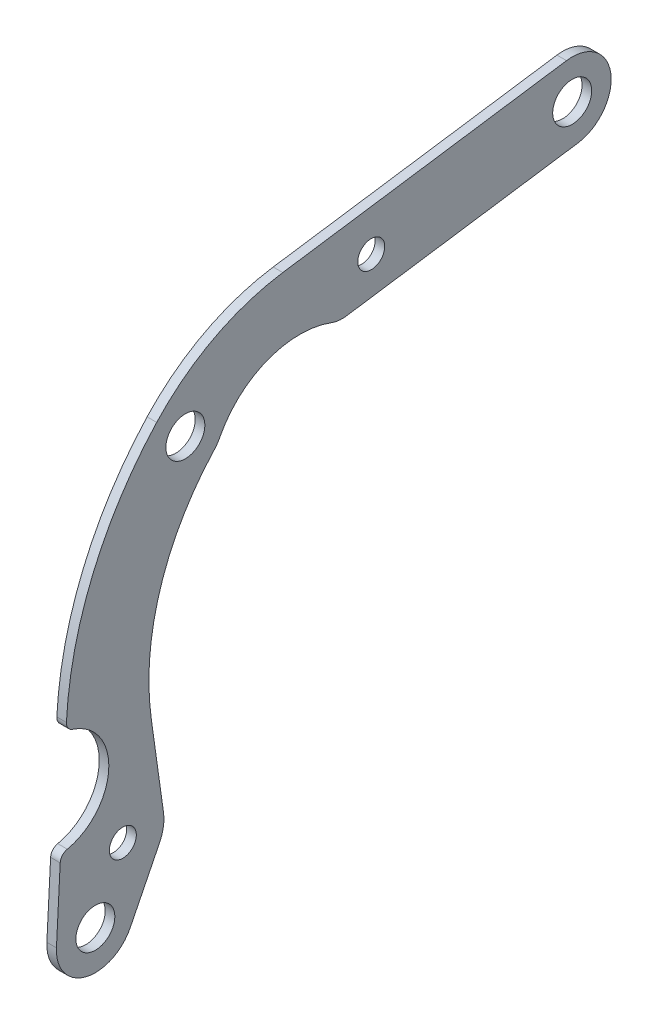
ISO-10303-21;
HEADER;
FILE_DESCRIPTION(('STEP AP214'),'2;1');
FILE_NAME('part.step','',(''),(''),'','','');
FILE_SCHEMA(('AUTOMOTIVE_DESIGN { 1 0 10303 214 1 1 1 1 }'));
ENDSEC;
DATA;
#1=APPLICATION_CONTEXT('core data for automotive mechanical design processes');
#2=APPLICATION_PROTOCOL_DEFINITION('international standard','automotive_design',2000,#1);
#3=PRODUCT_CONTEXT('',#1,'mechanical');
#4=PRODUCT('Part','Part','',(#3));
#5=PRODUCT_RELATED_PRODUCT_CATEGORY('part','',(#4));
#6=PRODUCT_DEFINITION_FORMATION('','',#4);
#7=PRODUCT_DEFINITION_CONTEXT('part definition',#1,'design');
#8=PRODUCT_DEFINITION('design','',#6,#7);
#9=PRODUCT_DEFINITION_SHAPE('','',#8);
#10=(LENGTH_UNIT() NAMED_UNIT(*) SI_UNIT(.MILLI.,.METRE.));
#11=(NAMED_UNIT(*) PLANE_ANGLE_UNIT() SI_UNIT($,.RADIAN.));
#12=(NAMED_UNIT(*) SI_UNIT($,.STERADIAN.) SOLID_ANGLE_UNIT());
#13=UNCERTAINTY_MEASURE_WITH_UNIT(LENGTH_MEASURE(1.E-05),#10,'distance_accuracy_value','');
#14=(GEOMETRIC_REPRESENTATION_CONTEXT(3) GLOBAL_UNCERTAINTY_ASSIGNED_CONTEXT((#13)) GLOBAL_UNIT_ASSIGNED_CONTEXT((#10,
#11,#12)) REPRESENTATION_CONTEXT('',''));
#15=CARTESIAN_POINT('',(0.,0.,0.));
#16=DIRECTION('',(0.,0.,1.));
#17=DIRECTION('',(1.,0.,0.));
#18=AXIS2_PLACEMENT_3D('',#15,#16,#17);
#19=CARTESIAN_POINT('',(3.2,159.099025766711,-159.099025767245));
#20=DIRECTION('',(1.,0.,0.));
#21=DIRECTION('',(0.,0.,-1.));
#22=AXIS2_PLACEMENT_3D('',#19,#20,#21);
#23=PLANE('',#22);
#24=CARTESIAN_POINT('',(3.2,19.9975389871156,-9.17051985760859));
#25=DIRECTION('',(1.,0.,0.));
#26=DIRECTION('',(0.,0.,-1.));
#27=AXIS2_PLACEMENT_3D('',#24,#25,#26);
#28=CIRCLE('',#27,4.5);
#29=CARTESIAN_POINT('',(3.2,19.9975389871156,-13.6705198576086));
#30=VERTEX_POINT('',#29);
#31=EDGE_CURVE('E397',#30,#30,#28,.T.);
#32=ORIENTED_EDGE('',*,*,#31,.F.);
#33=EDGE_LOOP('',(#32));
#34=FACE_BOUND('',#33,.T.);
#35=CARTESIAN_POINT('',(3.2,159.099025766711,-159.099025767245));
#36=DIRECTION('',(1.,0.,0.));
#37=DIRECTION('',(0.,0.,-1.));
#38=AXIS2_PLACEMENT_3D('',#35,#36,#37);
#39=CIRCLE('',#38,6.50000000000002);
#40=CARTESIAN_POINT('',(3.2,159.099025766711,-165.599025767245));
#41=VERTEX_POINT('',#40);
#42=EDGE_CURVE('E409',#41,#41,#39,.T.);
#43=ORIENTED_EDGE('',*,*,#42,.F.);
#44=EDGE_LOOP('',(#43));
#45=FACE_BOUND('',#44,.T.);
#46=CARTESIAN_POINT('',(3.2,159.099025766711,-159.099025767245));
#47=DIRECTION('',(1.,0.,0.));
#48=DIRECTION('',(0.,0.,-1.));
#49=AXIS2_PLACEMENT_3D('',#46,#47,#48);
#50=CIRCLE('',#49,12.9999999937128);
#51=CARTESIAN_POINT('',(3.2,146.237090088761,-160.988631666051));
#52=VERTEX_POINT('',#51);
#53=CARTESIAN_POINT('',(3.2,171.960961444661,-157.209419868439));
#54=VERTEX_POINT('',#53);
#55=EDGE_CURVE('E203',#52,#54,#50,.T.);
#56=ORIENTED_EDGE('',*,*,#55,.T.);
#57=DIRECTION('',(0.,-0.145354299978452,0.989379668013131));
#58=VECTOR('',#57,1.);
#59=CARTESIAN_POINT('',(3.2,158.051475499341,-62.5320516113296));
#60=LINE('',#59,#58);
#61=CARTESIAN_POINT('',(3.2,158.051475499341,-62.5320516113296));
#62=VERTEX_POINT('',#61);
#63=EDGE_CURVE('E162',#54,#62,#60,.T.);
#64=ORIENTED_EDGE('',*,*,#63,.T.);
#65=CARTESIAN_POINT('',(3.2,87.590518168881,-72.8837936772932));
#66=DIRECTION('',(1.,0.,0.));
#67=DIRECTION('',(0.,0.,-1.));
#68=AXIS2_PLACEMENT_3D('',#65,#66,#67);
#69=CIRCLE('',#68,71.2173087930536);
#70=CARTESIAN_POINT('',(3.2,135.797177398432,-20.4622038726038));
#71=VERTEX_POINT('',#70);
#72=EDGE_CURVE('E206',#62,#71,#69,.T.);
#73=ORIENTED_EDGE('',*,*,#72,.T.);
#74=CARTESIAN_POINT('',(3.2,58.1483291640224,-104.900249072292));
#75=DIRECTION('',(1.,0.,0.));
#76=DIRECTION('',(0.,0.,1.));
#77=AXIS2_PLACEMENT_3D('',#74,#75,#76);
#78=CIRCLE('',#77,114.713238596402);
#79=CARTESIAN_POINT('',(3.2,64.15195619969,9.65577901742271));
#80=VERTEX_POINT('',#79);
#81=EDGE_CURVE('E208',#71,#80,#78,.T.);
#82=ORIENTED_EDGE('',*,*,#81,.T.);
#83=CARTESIAN_POINT('',(3.2,63.9949483309612,6.65989041315899));
#84=DIRECTION('',(1.,0.,0.));
#85=DIRECTION('',(0.,0.,1.));
#86=AXIS2_PLACEMENT_3D('',#83,#84,#85);
#87=CIRCLE('',#86,3.);
#88=CARTESIAN_POINT('',(3.2,61.1420290630156,7.58771132830644));
#89=VERTEX_POINT('',#88);
#90=EDGE_CURVE('E210',#80,#89,#87,.T.);
#91=ORIENTED_EDGE('',*,*,#90,.T.);
#92=CARTESIAN_POINT('',(3.2,44.5,13.));
#93=DIRECTION('',(-1.,0.,0.));
#94=DIRECTION('',(0.,0.,-1.));
#95=AXIS2_PLACEMENT_3D('',#92,#93,#94);
#96=CIRCLE('',#95,17.5);
#97=CARTESIAN_POINT('',(3.2,27.3833994958627,9.35692613555977));
#98=VERTEX_POINT('',#97);
#99=EDGE_CURVE('E212',#89,#98,#96,.T.);
#100=ORIENTED_EDGE('',*,*,#99,.T.);
#101=CARTESIAN_POINT('',(3.2,24.4491251237249,8.73239918737002));
#102=DIRECTION('',(1.,0.,0.));
#103=DIRECTION('',(0.,0.,-1.));
#104=AXIS2_PLACEMENT_3D('',#101,#102,#103);
#105=CIRCLE('',#104,3.);
#106=CARTESIAN_POINT('',(3.2,24.6061329924537,11.7282877916337));
#107=VERTEX_POINT('',#106);
#108=EDGE_CURVE('E214',#98,#107,#105,.T.);
#109=ORIENTED_EDGE('',*,*,#108,.T.);
#110=DIRECTION('',(0.,-0.998629534754574,0.0523359562429439));
#111=VECTOR('',#110,1.);
#112=CARTESIAN_POINT('',(3.2,0.680367435367551,12.9821840321273));
#113=LINE('',#112,#111);
#114=CARTESIAN_POINT('',(3.2,0.680367435367553,12.9821840321273));
#115=VERTEX_POINT('',#114);
#116=EDGE_CURVE('E216',#107,#115,#113,.T.);
#117=ORIENTED_EDGE('',*,*,#116,.T.);
#118=CARTESIAN_POINT('',(3.2,0.,0.));
#119=DIRECTION('',(1.,0.,0.));
#120=DIRECTION('',(0.,0.,1.));
#121=AXIS2_PLACEMENT_3D('',#118,#119,#120);
#122=CIRCLE('',#121,13.0000000804281);
#123=CARTESIAN_POINT('',(3.2,-5.79652602743572,-11.6361629459367));
#124=VERTEX_POINT('',#123);
#125=EDGE_CURVE('E218',#115,#124,#122,.T.);
#126=ORIENTED_EDGE('',*,*,#125,.T.);
#127=DIRECTION('',(0.,0.895089451842029,-0.445886614736456));
#128=VECTOR('',#127,1.);
#129=CARTESIAN_POINT('',(3.2,-5.79652602743572,-11.6361629459367));
#130=LINE('',#129,#128);
#131=CARTESIAN_POINT('',(3.2,13.8852363402229,-21.4405845890503));
#132=VERTEX_POINT('',#131);
#133=EDGE_CURVE('E220',#124,#132,#130,.T.);
#134=ORIENTED_EDGE('',*,*,#133,.T.);
#135=CARTESIAN_POINT('',(3.2,19.9975389871156,-9.17051985760859));
#136=DIRECTION('',(1.,0.,0.));
#137=DIRECTION('',(0.,0.,-1.));
#138=AXIS2_PLACEMENT_3D('',#135,#136,#137);
#139=CIRCLE('',#138,13.70819945);
#140=CARTESIAN_POINT('',(3.2,21.9053516131511,-22.7453120528843));
#141=VERTEX_POINT('',#140);
#142=EDGE_CURVE('E222',#132,#141,#139,.T.);
#143=ORIENTED_EDGE('',*,*,#142,.T.);
#144=DIRECTION('',(0.,0.99026806874157,0.13917310096007));
#145=VECTOR('',#144,1.);
#146=CARTESIAN_POINT('',(3.2,21.9053516131511,-22.7453120528843));
#147=LINE('',#146,#145);
#148=CARTESIAN_POINT('',(3.2,50.9708881400787,-18.6604172883171));
#149=VERTEX_POINT('',#148);
#150=EDGE_CURVE('E224',#141,#149,#147,.T.);
#151=ORIENTED_EDGE('',*,*,#150,.T.);
#152=CARTESIAN_POINT('',(3.2,62.4358488709057,-100.237851740766));
#153=DIRECTION('',(-1.,0.,0.));
#154=DIRECTION('',(0.,0.,1.));
#155=AXIS2_PLACEMENT_3D('',#152,#153,#154);
#156=CIRCLE('',#155,82.3791426054128);
#157=CARTESIAN_POINT('',(3.2,118.197900575799,-39.6002666465051));
#158=VERTEX_POINT('',#157);
#159=EDGE_CURVE('E226',#149,#158,#156,.T.);
#160=ORIENTED_EDGE('',*,*,#159,.T.);
#161=CARTESIAN_POINT('',(3.2,126.997538987116,-30.0312352595543));
#162=DIRECTION('',(1.,0.,0.));
#163=DIRECTION('',(0.,0.,1.));
#164=AXIS2_PLACEMENT_3D('',#161,#162,#163);
#165=CIRCLE('',#164,12.9999999174754);
#166=CARTESIAN_POINT('',(3.2,121.057092834657,-41.5945867358393));
#167=VERTEX_POINT('',#166);
#168=EDGE_CURVE('E228',#158,#167,#165,.T.);
#169=ORIENTED_EDGE('',*,*,#168,.T.);
#170=CARTESIAN_POINT('',(3.2,107.348370857346,-68.2792441581981));
#171=DIRECTION('',(-1.,0.,0.));
#172=DIRECTION('',(0.,0.,-1.));
#173=AXIS2_PLACEMENT_3D('',#170,#171,#172);
#174=CIRCLE('',#173,29.9999999999979);
#175=CARTESIAN_POINT('',(3.2,135.430667579374,-78.8331349486049));
#176=VERTEX_POINT('',#175);
#177=EDGE_CURVE('E230',#167,#176,#174,.T.);
#178=ORIENTED_EDGE('',*,*,#177,.T.);
#179=CARTESIAN_POINT('',(3.2,144.791433153384,-82.3510985454074));
#180=DIRECTION('',(1.,0.,0.));
#181=DIRECTION('',(0.,0.,-1.));
#182=AXIS2_PLACEMENT_3D('',#179,#180,#181);
#183=CIRCLE('',#182,10.);
#184=CARTESIAN_POINT('',(3.2,134.897636473253,-83.8046415451919));
#185=VERTEX_POINT('',#184);
#186=EDGE_CURVE('E49',#176,#185,#183,.T.);
#187=ORIENTED_EDGE('',*,*,#186,.T.);
#188=DIRECTION('',(0.,0.145354299978454,-0.989379668013131));
#189=VECTOR('',#188,1.);
#190=CARTESIAN_POINT('',(3.2,134.897636473253,-83.8046415451919));
#191=LINE('',#190,#189);
#192=EDGE_CURVE('E44',#185,#52,#191,.T.);
#193=ORIENTED_EDGE('',*,*,#192,.T.);
#194=EDGE_LOOP('',(#56,#64,#73,#82,#91,#100,#109,#117,#126,#134,#143,#151,#160,#169,#178,#187,#193));
#195=FACE_BOUND('',#194,.T.);
#196=CARTESIAN_POINT('',(3.2,0.,0.));
#197=DIRECTION('',(1.,0.,0.));
#198=DIRECTION('',(0.,0.,-1.));
#199=AXIS2_PLACEMENT_3D('',#196,#197,#198);
#200=CIRCLE('',#199,6.5);
#201=CARTESIAN_POINT('',(3.2,0.,-6.5));
#202=VERTEX_POINT('',#201);
#203=EDGE_CURVE('E167',#202,#202,#200,.T.);
#204=ORIENTED_EDGE('',*,*,#203,.F.);
#205=EDGE_LOOP('',(#204));
#206=FACE_BOUND('',#205,.T.);
#207=CARTESIAN_POINT('',(3.2,126.997538987116,-30.0312352595543));
#208=DIRECTION('',(1.,0.,0.));
#209=DIRECTION('',(0.,0.,-1.));
#210=AXIS2_PLACEMENT_3D('',#207,#208,#209);
#211=CIRCLE('',#210,6.5);
#212=CARTESIAN_POINT('',(3.2,126.997538987116,-36.5312352595543));
#213=VERTEX_POINT('',#212);
#214=EDGE_CURVE('E403',#213,#213,#211,.T.);
#215=ORIENTED_EDGE('',*,*,#214,.F.);
#216=EDGE_LOOP('',(#215));
#217=FACE_BOUND('',#216,.T.);
#218=CARTESIAN_POINT('',(3.2,148.60549831565,-92.0499069049917));
#219=DIRECTION('',(1.,0.,0.));
#220=DIRECTION('',(0.,0.,-1.));
#221=AXIS2_PLACEMENT_3D('',#218,#219,#220);
#222=CIRCLE('',#221,4.50000000000001);
#223=CARTESIAN_POINT('',(3.2,148.60549831565,-96.5499069049917));
#224=VERTEX_POINT('',#223);
#225=EDGE_CURVE('E386',#224,#224,#222,.T.);
#226=ORIENTED_EDGE('',*,*,#225,.F.);
#227=EDGE_LOOP('',(#226));
#228=FACE_BOUND('',#227,.T.);
#229=ADVANCED_FACE('F29',(#34,#45,#195,#206,#217,#228),#23,.T.);
#230=CARTESIAN_POINT('',(0.,159.099025766711,-159.099025767245));
#231=DIRECTION('',(1.,0.,0.));
#232=DIRECTION('',(0.,0.,-1.));
#233=AXIS2_PLACEMENT_3D('',#230,#231,#232);
#234=PLANE('',#233);
#235=CARTESIAN_POINT('',(0.,19.9975389871156,-9.17051985760859));
#236=DIRECTION('',(1.,0.,0.));
#237=DIRECTION('',(0.,0.,-1.));
#238=AXIS2_PLACEMENT_3D('',#235,#236,#237);
#239=CIRCLE('',#238,4.5);
#240=CARTESIAN_POINT('',(0.,19.9975389871156,-13.6705198576086));
#241=VERTEX_POINT('',#240);
#242=EDGE_CURVE('E392',#241,#241,#239,.T.);
#243=ORIENTED_EDGE('',*,*,#242,.T.);
#244=EDGE_LOOP('',(#243));
#245=FACE_BOUND('',#244,.T.);
#246=CARTESIAN_POINT('',(0.,159.099025766711,-159.099025767245));
#247=DIRECTION('',(1.,0.,0.));
#248=DIRECTION('',(0.,0.,-1.));
#249=AXIS2_PLACEMENT_3D('',#246,#247,#248);
#250=CIRCLE('',#249,6.50000000000002);
#251=CARTESIAN_POINT('',(0.,159.099025766711,-165.599025767245));
#252=VERTEX_POINT('',#251);
#253=EDGE_CURVE('E406',#252,#252,#250,.T.);
#254=ORIENTED_EDGE('',*,*,#253,.T.);
#255=EDGE_LOOP('',(#254));
#256=FACE_BOUND('',#255,.T.);
#257=CARTESIAN_POINT('',(0.,159.099025766711,-159.099025767245));
#258=DIRECTION('',(1.,0.,0.));
#259=DIRECTION('',(0.,0.,-1.));
#260=AXIS2_PLACEMENT_3D('',#257,#258,#259);
#261=CIRCLE('',#260,12.9999999937128);
#262=CARTESIAN_POINT('',(0.,146.237090088761,-160.988631666051));
#263=VERTEX_POINT('',#262);
#264=CARTESIAN_POINT('',(0.,171.960961444661,-157.209419868439));
#265=VERTEX_POINT('',#264);
#266=EDGE_CURVE('E153',#263,#265,#261,.T.);
#267=ORIENTED_EDGE('',*,*,#266,.F.);
#268=DIRECTION('',(0.,0.145354299978454,-0.989379668013131));
#269=VECTOR('',#268,1.);
#270=CARTESIAN_POINT('',(0.,134.897636473253,-83.8046415451919));
#271=LINE('',#270,#269);
#272=CARTESIAN_POINT('',(0.,134.897636473253,-83.8046415451919));
#273=VERTEX_POINT('',#272);
#274=EDGE_CURVE('E201',#273,#263,#271,.T.);
#275=ORIENTED_EDGE('',*,*,#274,.F.);
#276=CARTESIAN_POINT('',(0.,144.791433153384,-82.3510985454074));
#277=DIRECTION('',(1.,0.,0.));
#278=DIRECTION('',(0.,0.,-1.));
#279=AXIS2_PLACEMENT_3D('',#276,#277,#278);
#280=CIRCLE('',#279,10.);
#281=CARTESIAN_POINT('',(0.,135.430667579374,-78.8331349486049));
#282=VERTEX_POINT('',#281);
#283=EDGE_CURVE('E199',#282,#273,#280,.T.);
#284=ORIENTED_EDGE('',*,*,#283,.F.);
#285=CARTESIAN_POINT('',(0.,107.348370857346,-68.2792441581981));
#286=DIRECTION('',(-1.,0.,0.));
#287=DIRECTION('',(0.,0.,-1.));
#288=AXIS2_PLACEMENT_3D('',#285,#286,#287);
#289=CIRCLE('',#288,29.9999999999979);
#290=CARTESIAN_POINT('',(0.,121.057092834657,-41.5945867358393));
#291=VERTEX_POINT('',#290);
#292=EDGE_CURVE('E197',#291,#282,#289,.T.);
#293=ORIENTED_EDGE('',*,*,#292,.F.);
#294=CARTESIAN_POINT('',(0.,126.997538987116,-30.0312352595543));
#295=DIRECTION('',(1.,0.,0.));
#296=DIRECTION('',(0.,0.,1.));
#297=AXIS2_PLACEMENT_3D('',#294,#295,#296);
#298=CIRCLE('',#297,12.9999999174754);
#299=CARTESIAN_POINT('',(0.,118.197900575799,-39.6002666465051));
#300=VERTEX_POINT('',#299);
#301=EDGE_CURVE('E195',#300,#291,#298,.T.);
#302=ORIENTED_EDGE('',*,*,#301,.F.);
#303=CARTESIAN_POINT('',(0.,62.4358488709057,-100.237851740766));
#304=DIRECTION('',(-1.,0.,0.));
#305=DIRECTION('',(0.,0.,1.));
#306=AXIS2_PLACEMENT_3D('',#303,#304,#305);
#307=CIRCLE('',#306,82.3791426054128);
#308=CARTESIAN_POINT('',(0.,50.9708881400787,-18.6604172883171));
#309=VERTEX_POINT('',#308);
#310=EDGE_CURVE('E193',#309,#300,#307,.T.);
#311=ORIENTED_EDGE('',*,*,#310,.F.);
#312=DIRECTION('',(0.,0.99026806874157,0.13917310096007));
#313=VECTOR('',#312,1.);
#314=CARTESIAN_POINT('',(0.,21.9053516131511,-22.7453120528843));
#315=LINE('',#314,#313);
#316=CARTESIAN_POINT('',(0.,21.9053516131511,-22.7453120528843));
#317=VERTEX_POINT('',#316);
#318=EDGE_CURVE('E191',#317,#309,#315,.T.);
#319=ORIENTED_EDGE('',*,*,#318,.F.);
#320=CARTESIAN_POINT('',(0.,19.9975389871156,-9.17051985760859));
#321=DIRECTION('',(1.,0.,0.));
#322=DIRECTION('',(0.,0.,-1.));
#323=AXIS2_PLACEMENT_3D('',#320,#321,#322);
#324=CIRCLE('',#323,13.70819945);
#325=CARTESIAN_POINT('',(0.,13.8852363402229,-21.4405845890503));
#326=VERTEX_POINT('',#325);
#327=EDGE_CURVE('E189',#326,#317,#324,.T.);
#328=ORIENTED_EDGE('',*,*,#327,.F.);
#329=DIRECTION('',(0.,0.895089451842029,-0.445886614736456));
#330=VECTOR('',#329,1.);
#331=CARTESIAN_POINT('',(0.,-5.79652602743572,-11.6361629459367));
#332=LINE('',#331,#330);
#333=CARTESIAN_POINT('',(0.,-5.79652602743572,-11.6361629459367));
#334=VERTEX_POINT('',#333);
#335=EDGE_CURVE('E187',#334,#326,#332,.T.);
#336=ORIENTED_EDGE('',*,*,#335,.F.);
#337=CARTESIAN_POINT('',(0.,0.,0.));
#338=DIRECTION('',(1.,0.,0.));
#339=DIRECTION('',(0.,0.,1.));
#340=AXIS2_PLACEMENT_3D('',#337,#338,#339);
#341=CIRCLE('',#340,13.0000000804281);
#342=CARTESIAN_POINT('',(0.,0.680367435367553,12.9821840321273));
#343=VERTEX_POINT('',#342);
#344=EDGE_CURVE('E185',#343,#334,#341,.T.);
#345=ORIENTED_EDGE('',*,*,#344,.F.);
#346=DIRECTION('',(0.,-0.998629534754574,0.0523359562429439));
#347=VECTOR('',#346,1.);
#348=CARTESIAN_POINT('',(0.,0.680367435367551,12.9821840321273));
#349=LINE('',#348,#347);
#350=CARTESIAN_POINT('',(0.,24.6061329924537,11.7282877916337));
#351=VERTEX_POINT('',#350);
#352=EDGE_CURVE('E183',#351,#343,#349,.T.);
#353=ORIENTED_EDGE('',*,*,#352,.F.);
#354=CARTESIAN_POINT('',(0.,24.4491251237249,8.73239918737002));
#355=DIRECTION('',(1.,0.,0.));
#356=DIRECTION('',(0.,0.,-1.));
#357=AXIS2_PLACEMENT_3D('',#354,#355,#356);
#358=CIRCLE('',#357,3.);
#359=CARTESIAN_POINT('',(0.,27.3833994958627,9.35692613555977));
#360=VERTEX_POINT('',#359);
#361=EDGE_CURVE('E181',#360,#351,#358,.T.);
#362=ORIENTED_EDGE('',*,*,#361,.F.);
#363=CARTESIAN_POINT('',(0.,44.5,13.));
#364=DIRECTION('',(-1.,0.,0.));
#365=DIRECTION('',(0.,0.,-1.));
#366=AXIS2_PLACEMENT_3D('',#363,#364,#365);
#367=CIRCLE('',#366,17.5);
#368=CARTESIAN_POINT('',(0.,61.1420290630156,7.58771132830644));
#369=VERTEX_POINT('',#368);
#370=EDGE_CURVE('E179',#369,#360,#367,.T.);
#371=ORIENTED_EDGE('',*,*,#370,.F.);
#372=CARTESIAN_POINT('',(0.,63.9949483309612,6.65989041315899));
#373=DIRECTION('',(1.,0.,0.));
#374=DIRECTION('',(0.,0.,1.));
#375=AXIS2_PLACEMENT_3D('',#372,#373,#374);
#376=CIRCLE('',#375,3.);
#377=CARTESIAN_POINT('',(0.,64.15195619969,9.65577901742271));
#378=VERTEX_POINT('',#377);
#379=EDGE_CURVE('E177',#378,#369,#376,.T.);
#380=ORIENTED_EDGE('',*,*,#379,.F.);
#381=CARTESIAN_POINT('',(0.,58.1483291640224,-104.900249072292));
#382=DIRECTION('',(1.,0.,0.));
#383=DIRECTION('',(0.,0.,1.));
#384=AXIS2_PLACEMENT_3D('',#381,#382,#383);
#385=CIRCLE('',#384,114.713238596402);
#386=CARTESIAN_POINT('',(0.,135.797177398432,-20.4622038726038));
#387=VERTEX_POINT('',#386);
#388=EDGE_CURVE('E175',#387,#378,#385,.T.);
#389=ORIENTED_EDGE('',*,*,#388,.F.);
#390=CARTESIAN_POINT('',(0.,87.590518168881,-72.8837936772932));
#391=DIRECTION('',(1.,0.,0.));
#392=DIRECTION('',(0.,0.,-1.));
#393=AXIS2_PLACEMENT_3D('',#390,#391,#392);
#394=CIRCLE('',#393,71.2173087930536);
#395=CARTESIAN_POINT('',(0.,158.051475499341,-62.5320516113296));
#396=VERTEX_POINT('',#395);
#397=EDGE_CURVE('E155',#396,#387,#394,.T.);
#398=ORIENTED_EDGE('',*,*,#397,.F.);
#399=DIRECTION('',(0.,-0.145354299978452,0.989379668013131));
#400=VECTOR('',#399,1.);
#401=CARTESIAN_POINT('',(0.,158.051475499341,-62.5320516113296));
#402=LINE('',#401,#400);
#403=EDGE_CURVE('E148',#265,#396,#402,.T.);
#404=ORIENTED_EDGE('',*,*,#403,.F.);
#405=EDGE_LOOP('',(#267,#275,#284,#293,#302,#311,#319,#328,#336,#345,#353,#362,#371,#380,#389,
#398,#404));
#406=FACE_BOUND('',#405,.T.);
#407=CARTESIAN_POINT('',(0.,0.,0.));
#408=DIRECTION('',(1.,0.,0.));
#409=DIRECTION('',(0.,0.,-1.));
#410=AXIS2_PLACEMENT_3D('',#407,#408,#409);
#411=CIRCLE('',#410,6.5);
#412=CARTESIAN_POINT('',(0.,0.,-6.5));
#413=VERTEX_POINT('',#412);
#414=EDGE_CURVE('E170',#413,#413,#411,.T.);
#415=ORIENTED_EDGE('',*,*,#414,.T.);
#416=EDGE_LOOP('',(#415));
#417=FACE_BOUND('',#416,.T.);
#418=CARTESIAN_POINT('',(0.,126.997538987116,-30.0312352595543));
#419=DIRECTION('',(1.,0.,0.));
#420=DIRECTION('',(0.,0.,-1.));
#421=AXIS2_PLACEMENT_3D('',#418,#419,#420);
#422=CIRCLE('',#421,6.5);
#423=CARTESIAN_POINT('',(0.,126.997538987116,-36.5312352595543));
#424=VERTEX_POINT('',#423);
#425=EDGE_CURVE('E400',#424,#424,#422,.T.);
#426=ORIENTED_EDGE('',*,*,#425,.T.);
#427=EDGE_LOOP('',(#426));
#428=FACE_BOUND('',#427,.T.);
#429=CARTESIAN_POINT('',(0.,148.60549831565,-92.0499069049917));
#430=DIRECTION('',(1.,0.,0.));
#431=DIRECTION('',(0.,0.,-1.));
#432=AXIS2_PLACEMENT_3D('',#429,#430,#431);
#433=CIRCLE('',#432,4.50000000000001);
#434=CARTESIAN_POINT('',(0.,148.60549831565,-96.5499069049917));
#435=VERTEX_POINT('',#434);
#436=EDGE_CURVE('E389',#435,#435,#433,.T.);
#437=ORIENTED_EDGE('',*,*,#436,.T.);
#438=EDGE_LOOP('',(#437));
#439=FACE_BOUND('',#438,.T.);
#440=ADVANCED_FACE('F149',(#245,#256,#406,#417,#428,#439),#234,.F.);
#441=CARTESIAN_POINT('',(3.2,159.099025766711,-159.099025767245));
#442=DIRECTION('',(-1.,0.,0.));
#443=DIRECTION('',(0.,0.,1.));
#444=AXIS2_PLACEMENT_3D('',#441,#442,#443);
#445=CYLINDRICAL_SURFACE('',#444,12.9999999937128);
#446=ORIENTED_EDGE('',*,*,#266,.T.);
#447=DIRECTION('',(-1.,0.,0.));
#448=VECTOR('',#447,1.);
#449=CARTESIAN_POINT('',(3.2,171.960961444661,-157.209419868439));
#450=LINE('',#449,#448);
#451=EDGE_CURVE('E11',#54,#265,#450,.T.);
#452=ORIENTED_EDGE('',*,*,#451,.F.);
#453=ORIENTED_EDGE('',*,*,#55,.F.);
#454=DIRECTION('',(-1.,0.,0.));
#455=VECTOR('',#454,1.);
#456=CARTESIAN_POINT('',(3.2,146.237090088761,-160.988631666051));
#457=LINE('',#456,#455);
#458=EDGE_CURVE('E166',#52,#263,#457,.T.);
#459=ORIENTED_EDGE('',*,*,#458,.T.);
#460=EDGE_LOOP('',(#446,#452,#453,#459));
#461=FACE_BOUND('',#460,.T.);
#462=ADVANCED_FACE('F31',(#461),#445,.T.);
#463=CARTESIAN_POINT('',(3.2,158.051475499341,-62.5320516113296));
#464=DIRECTION('',(0.,-0.989379668013131,-0.145354299978452));
#465=DIRECTION('',(0.,0.145354299978452,-0.989379668013131));
#466=AXIS2_PLACEMENT_3D('',#463,#464,#465);
#467=PLANE('',#466);
#468=ORIENTED_EDGE('',*,*,#403,.T.);
#469=DIRECTION('',(-1.,0.,0.));
#470=VECTOR('',#469,1.);
#471=CARTESIAN_POINT('',(3.2,158.051475499341,-62.5320516113296));
#472=LINE('',#471,#470);
#473=EDGE_CURVE('E37',#62,#396,#472,.T.);
#474=ORIENTED_EDGE('',*,*,#473,.F.);
#475=ORIENTED_EDGE('',*,*,#63,.F.);
#476=ORIENTED_EDGE('',*,*,#451,.T.);
#477=EDGE_LOOP('',(#468,#474,#475,#476));
#478=FACE_BOUND('',#477,.T.);
#479=ADVANCED_FACE('F161',(#478),#467,.F.);
#480=CARTESIAN_POINT('',(3.2,87.590518168881,-72.8837936772932));
#481=DIRECTION('',(-1.,0.,0.));
#482=DIRECTION('',(0.,0.,1.));
#483=AXIS2_PLACEMENT_3D('',#480,#481,#482);
#484=CYLINDRICAL_SURFACE('',#483,71.2173087930536);
#485=ORIENTED_EDGE('',*,*,#397,.T.);
#486=DIRECTION('',(-1.,0.,0.));
#487=VECTOR('',#486,1.);
#488=CARTESIAN_POINT('',(3.2,135.797177398432,-20.4622038726038));
#489=LINE('',#488,#487);
#490=EDGE_CURVE('E274',#71,#387,#489,.T.);
#491=ORIENTED_EDGE('',*,*,#490,.F.);
#492=ORIENTED_EDGE('',*,*,#72,.F.);
#493=ORIENTED_EDGE('',*,*,#473,.T.);
#494=EDGE_LOOP('',(#485,#491,#492,#493));
#495=FACE_BOUND('',#494,.T.);
#496=ADVANCED_FACE('F278',(#495),#484,.T.);
#497=CARTESIAN_POINT('',(3.2,58.1483291640224,-104.900249072292));
#498=DIRECTION('',(-1.,0.,0.));
#499=DIRECTION('',(0.,0.,1.));
#500=AXIS2_PLACEMENT_3D('',#497,#498,#499);
#501=CYLINDRICAL_SURFACE('',#500,114.713238596402);
#502=ORIENTED_EDGE('',*,*,#388,.T.);
#503=DIRECTION('',(-1.,0.,0.));
#504=VECTOR('',#503,1.);
#505=CARTESIAN_POINT('',(3.2,64.15195619969,9.65577901742271));
#506=LINE('',#505,#504);
#507=EDGE_CURVE('E271',#80,#378,#506,.T.);
#508=ORIENTED_EDGE('',*,*,#507,.F.);
#509=ORIENTED_EDGE('',*,*,#81,.F.);
#510=ORIENTED_EDGE('',*,*,#490,.T.);
#511=EDGE_LOOP('',(#502,#508,#509,#510));
#512=FACE_BOUND('',#511,.T.);
#513=ADVANCED_FACE('F286',(#512),#501,.T.);
#514=CARTESIAN_POINT('',(3.2,63.9949483309612,6.65989041315899));
#515=DIRECTION('',(-1.,0.,0.));
#516=DIRECTION('',(0.,0.,1.));
#517=AXIS2_PLACEMENT_3D('',#514,#515,#516);
#518=CYLINDRICAL_SURFACE('',#517,3.);
#519=ORIENTED_EDGE('',*,*,#379,.T.);
#520=DIRECTION('',(-1.,0.,0.));
#521=VECTOR('',#520,1.);
#522=CARTESIAN_POINT('',(3.2,61.1420290630156,7.58771132830644));
#523=LINE('',#522,#521);
#524=EDGE_CURVE('E268',#89,#369,#523,.T.);
#525=ORIENTED_EDGE('',*,*,#524,.F.);
#526=ORIENTED_EDGE('',*,*,#90,.F.);
#527=ORIENTED_EDGE('',*,*,#507,.T.);
#528=EDGE_LOOP('',(#519,#525,#526,#527));
#529=FACE_BOUND('',#528,.T.);
#530=ADVANCED_FACE('F289',(#529),#518,.T.);
#531=CARTESIAN_POINT('',(3.2,44.5,13.));
#532=DIRECTION('',(-1.,0.,0.));
#533=DIRECTION('',(0.,0.,1.));
#534=AXIS2_PLACEMENT_3D('',#531,#532,#533);
#535=CYLINDRICAL_SURFACE('',#534,17.5);
#536=ORIENTED_EDGE('',*,*,#370,.T.);
#537=DIRECTION('',(-1.,0.,0.));
#538=VECTOR('',#537,1.);
#539=CARTESIAN_POINT('',(3.2,27.3833994958627,9.35692613555977));
#540=LINE('',#539,#538);
#541=EDGE_CURVE('E265',#98,#360,#540,.T.);
#542=ORIENTED_EDGE('',*,*,#541,.F.);
#543=ORIENTED_EDGE('',*,*,#99,.F.);
#544=ORIENTED_EDGE('',*,*,#524,.T.);
#545=EDGE_LOOP('',(#536,#542,#543,#544));
#546=FACE_BOUND('',#545,.T.);
#547=ADVANCED_FACE('F294',(#546),#535,.F.);
#548=CARTESIAN_POINT('',(3.2,24.4491251237249,8.73239918737002));
#549=DIRECTION('',(-1.,0.,0.));
#550=DIRECTION('',(0.,0.,1.));
#551=AXIS2_PLACEMENT_3D('',#548,#549,#550);
#552=CYLINDRICAL_SURFACE('',#551,3.);
#553=ORIENTED_EDGE('',*,*,#361,.T.);
#554=DIRECTION('',(-1.,0.,0.));
#555=VECTOR('',#554,1.);
#556=CARTESIAN_POINT('',(3.2,24.6061329924537,11.7282877916337));
#557=LINE('',#556,#555);
#558=EDGE_CURVE('E262',#107,#351,#557,.T.);
#559=ORIENTED_EDGE('',*,*,#558,.F.);
#560=ORIENTED_EDGE('',*,*,#108,.F.);
#561=ORIENTED_EDGE('',*,*,#541,.T.);
#562=EDGE_LOOP('',(#553,#559,#560,#561));
#563=FACE_BOUND('',#562,.T.);
#564=ADVANCED_FACE('F300',(#563),#552,.T.);
#565=CARTESIAN_POINT('',(3.2,0.680367435367551,12.9821840321273));
#566=DIRECTION('',(0.,-0.0523359562429439,-0.998629534754574));
#567=DIRECTION('',(0.,0.998629534754574,-0.0523359562429439));
#568=AXIS2_PLACEMENT_3D('',#565,#566,#567);
#569=PLANE('',#568);
#570=ORIENTED_EDGE('',*,*,#352,.T.);
#571=DIRECTION('',(-1.,0.,0.));
#572=VECTOR('',#571,1.);
#573=CARTESIAN_POINT('',(3.2,0.680367435367553,12.9821840321273));
#574=LINE('',#573,#572);
#575=EDGE_CURVE('E259',#115,#343,#574,.T.);
#576=ORIENTED_EDGE('',*,*,#575,.F.);
#577=ORIENTED_EDGE('',*,*,#116,.F.);
#578=ORIENTED_EDGE('',*,*,#558,.T.);
#579=EDGE_LOOP('',(#570,#576,#577,#578));
#580=FACE_BOUND('',#579,.T.);
#581=ADVANCED_FACE('F304',(#580),#569,.F.);
#582=CARTESIAN_POINT('',(3.2,0.,0.));
#583=DIRECTION('',(-1.,0.,0.));
#584=DIRECTION('',(0.,0.,1.));
#585=AXIS2_PLACEMENT_3D('',#582,#583,#584);
#586=CYLINDRICAL_SURFACE('',#585,13.0000000804281);
#587=ORIENTED_EDGE('',*,*,#344,.T.);
#588=DIRECTION('',(-1.,0.,0.));
#589=VECTOR('',#588,1.);
#590=CARTESIAN_POINT('',(3.2,-5.79652602743572,-11.6361629459367));
#591=LINE('',#590,#589);
#592=EDGE_CURVE('E256',#124,#334,#591,.T.);
#593=ORIENTED_EDGE('',*,*,#592,.F.);
#594=ORIENTED_EDGE('',*,*,#125,.F.);
#595=ORIENTED_EDGE('',*,*,#575,.T.);
#596=EDGE_LOOP('',(#587,#593,#594,#595));
#597=FACE_BOUND('',#596,.T.);
#598=ADVANCED_FACE('F309',(#597),#586,.T.);
#599=CARTESIAN_POINT('',(3.2,-5.79652602743572,-11.6361629459367));
#600=DIRECTION('',(0.,0.445886614736456,0.895089451842029));
#601=DIRECTION('',(0.,-0.895089451842029,0.445886614736456));
#602=AXIS2_PLACEMENT_3D('',#599,#600,#601);
#603=PLANE('',#602);
#604=ORIENTED_EDGE('',*,*,#335,.T.);
#605=DIRECTION('',(-1.,0.,0.));
#606=VECTOR('',#605,1.);
#607=CARTESIAN_POINT('',(3.2,13.8852363402229,-21.4405845890503));
#608=LINE('',#607,#606);
#609=EDGE_CURVE('E253',#132,#326,#608,.T.);
#610=ORIENTED_EDGE('',*,*,#609,.F.);
#611=ORIENTED_EDGE('',*,*,#133,.F.);
#612=ORIENTED_EDGE('',*,*,#592,.T.);
#613=EDGE_LOOP('',(#604,#610,#611,#612));
#614=FACE_BOUND('',#613,.T.);
#615=ADVANCED_FACE('F315',(#614),#603,.F.);
#616=CARTESIAN_POINT('',(3.2,19.9975389871156,-9.17051985760859));
#617=DIRECTION('',(-1.,0.,0.));
#618=DIRECTION('',(0.,0.,1.));
#619=AXIS2_PLACEMENT_3D('',#616,#617,#618);
#620=CYLINDRICAL_SURFACE('',#619,13.70819945);
#621=ORIENTED_EDGE('',*,*,#327,.T.);
#622=DIRECTION('',(-1.,0.,0.));
#623=VECTOR('',#622,1.);
#624=CARTESIAN_POINT('',(3.2,21.9053516131511,-22.7453120528843));
#625=LINE('',#624,#623);
#626=EDGE_CURVE('E250',#141,#317,#625,.T.);
#627=ORIENTED_EDGE('',*,*,#626,.F.);
#628=ORIENTED_EDGE('',*,*,#142,.F.);
#629=ORIENTED_EDGE('',*,*,#609,.T.);
#630=EDGE_LOOP('',(#621,#627,#628,#629));
#631=FACE_BOUND('',#630,.T.);
#632=ADVANCED_FACE('F319',(#631),#620,.T.);
#633=CARTESIAN_POINT('',(3.2,21.9053516131511,-22.7453120528843));
#634=DIRECTION('',(0.,-0.13917310096007,0.99026806874157));
#635=DIRECTION('',(0.,-0.99026806874157,-0.13917310096007));
#636=AXIS2_PLACEMENT_3D('',#633,#634,#635);
#637=PLANE('',#636);
#638=ORIENTED_EDGE('',*,*,#318,.T.);
#639=DIRECTION('',(-1.,0.,0.));
#640=VECTOR('',#639,1.);
#641=CARTESIAN_POINT('',(3.2,50.9708881400787,-18.6604172883171));
#642=LINE('',#641,#640);
#643=EDGE_CURVE('E247',#149,#309,#642,.T.);
#644=ORIENTED_EDGE('',*,*,#643,.F.);
#645=ORIENTED_EDGE('',*,*,#150,.F.);
#646=ORIENTED_EDGE('',*,*,#626,.T.);
#647=EDGE_LOOP('',(#638,#644,#645,#646));
#648=FACE_BOUND('',#647,.T.);
#649=ADVANCED_FACE('F324',(#648),#637,.F.);
#650=CARTESIAN_POINT('',(3.2,62.4358488709057,-100.237851740766));
#651=DIRECTION('',(-1.,0.,0.));
#652=DIRECTION('',(0.,0.,1.));
#653=AXIS2_PLACEMENT_3D('',#650,#651,#652);
#654=CYLINDRICAL_SURFACE('',#653,82.3791426054128);
#655=ORIENTED_EDGE('',*,*,#310,.T.);
#656=DIRECTION('',(-1.,0.,0.));
#657=VECTOR('',#656,1.);
#658=CARTESIAN_POINT('',(3.2,118.197900575799,-39.6002666465051));
#659=LINE('',#658,#657);
#660=EDGE_CURVE('E244',#158,#300,#659,.T.);
#661=ORIENTED_EDGE('',*,*,#660,.F.);
#662=ORIENTED_EDGE('',*,*,#159,.F.);
#663=ORIENTED_EDGE('',*,*,#643,.T.);
#664=EDGE_LOOP('',(#655,#661,#662,#663));
#665=FACE_BOUND('',#664,.T.);
#666=ADVANCED_FACE('F330',(#665),#654,.F.);
#667=CARTESIAN_POINT('',(3.2,126.997538987116,-30.0312352595543));
#668=DIRECTION('',(-1.,0.,0.));
#669=DIRECTION('',(0.,0.,1.));
#670=AXIS2_PLACEMENT_3D('',#667,#668,#669);
#671=CYLINDRICAL_SURFACE('',#670,12.9999999174754);
#672=ORIENTED_EDGE('',*,*,#301,.T.);
#673=DIRECTION('',(-1.,0.,0.));
#674=VECTOR('',#673,1.);
#675=CARTESIAN_POINT('',(3.2,121.057092834657,-41.5945867358393));
#676=LINE('',#675,#674);
#677=EDGE_CURVE('E241',#167,#291,#676,.T.);
#678=ORIENTED_EDGE('',*,*,#677,.F.);
#679=ORIENTED_EDGE('',*,*,#168,.F.);
#680=ORIENTED_EDGE('',*,*,#660,.T.);
#681=EDGE_LOOP('',(#672,#678,#679,#680));
#682=FACE_BOUND('',#681,.T.);
#683=ADVANCED_FACE('F334',(#682),#671,.T.);
#684=CARTESIAN_POINT('',(3.2,107.348370857346,-68.2792441581981));
#685=DIRECTION('',(-1.,0.,0.));
#686=DIRECTION('',(0.,0.,1.));
#687=AXIS2_PLACEMENT_3D('',#684,#685,#686);
#688=CYLINDRICAL_SURFACE('',#687,29.9999999999979);
#689=ORIENTED_EDGE('',*,*,#292,.T.);
#690=DIRECTION('',(-1.,0.,0.));
#691=VECTOR('',#690,1.);
#692=CARTESIAN_POINT('',(3.2,135.430667579374,-78.8331349486049));
#693=LINE('',#692,#691);
#694=EDGE_CURVE('E238',#176,#282,#693,.T.);
#695=ORIENTED_EDGE('',*,*,#694,.F.);
#696=ORIENTED_EDGE('',*,*,#177,.F.);
#697=ORIENTED_EDGE('',*,*,#677,.T.);
#698=EDGE_LOOP('',(#689,#695,#696,#697));
#699=FACE_BOUND('',#698,.T.);
#700=ADVANCED_FACE('F339',(#699),#688,.F.);
#701=CARTESIAN_POINT('',(3.2,144.791433153384,-82.3510985454074));
#702=DIRECTION('',(-1.,0.,0.));
#703=DIRECTION('',(0.,0.,1.));
#704=AXIS2_PLACEMENT_3D('',#701,#702,#703);
#705=CYLINDRICAL_SURFACE('',#704,10.);
#706=ORIENTED_EDGE('',*,*,#283,.T.);
#707=DIRECTION('',(-1.,0.,0.));
#708=VECTOR('',#707,1.);
#709=CARTESIAN_POINT('',(3.2,134.897636473253,-83.8046415451919));
#710=LINE('',#709,#708);
#711=EDGE_CURVE('E235',#185,#273,#710,.T.);
#712=ORIENTED_EDGE('',*,*,#711,.F.);
#713=ORIENTED_EDGE('',*,*,#186,.F.);
#714=ORIENTED_EDGE('',*,*,#694,.T.);
#715=EDGE_LOOP('',(#706,#712,#713,#714));
#716=FACE_BOUND('',#715,.T.);
#717=ADVANCED_FACE('F342',(#716),#705,.T.);
#718=CARTESIAN_POINT('',(3.2,134.897636473253,-83.8046415451919));
#719=DIRECTION('',(0.,0.989379668013131,0.145354299978454));
#720=DIRECTION('',(0.,-0.145354299978454,0.989379668013131));
#721=AXIS2_PLACEMENT_3D('',#718,#719,#720);
#722=PLANE('',#721);
#723=ORIENTED_EDGE('',*,*,#274,.T.);
#724=ORIENTED_EDGE('',*,*,#458,.F.);
#725=ORIENTED_EDGE('',*,*,#192,.F.);
#726=ORIENTED_EDGE('',*,*,#711,.T.);
#727=EDGE_LOOP('',(#723,#724,#725,#726));
#728=FACE_BOUND('',#727,.T.);
#729=ADVANCED_FACE('F344',(#728),#722,.F.);
#730=CARTESIAN_POINT('',(3.2,0.,0.));
#731=DIRECTION('',(-1.,0.,0.));
#732=DIRECTION('',(0.,0.,1.));
#733=AXIS2_PLACEMENT_3D('',#730,#731,#732);
#734=CYLINDRICAL_SURFACE('',#733,6.5);
#735=ORIENTED_EDGE('',*,*,#203,.T.);
#736=EDGE_LOOP('',(#735));
#737=FACE_BOUND('',#736,.T.);
#738=ORIENTED_EDGE('',*,*,#414,.F.);
#739=EDGE_LOOP('',(#738));
#740=FACE_BOUND('',#739,.T.);
#741=ADVANCED_FACE('F346',(#737,#740),#734,.F.);
#742=CARTESIAN_POINT('',(3.2,159.099025766711,-159.099025767245));
#743=DIRECTION('',(-1.,0.,0.));
#744=DIRECTION('',(0.,0.,1.));
#745=AXIS2_PLACEMENT_3D('',#742,#743,#744);
#746=CYLINDRICAL_SURFACE('',#745,6.50000000000002);
#747=ORIENTED_EDGE('',*,*,#42,.T.);
#748=EDGE_LOOP('',(#747));
#749=FACE_BOUND('',#748,.T.);
#750=ORIENTED_EDGE('',*,*,#253,.F.);
#751=EDGE_LOOP('',(#750));
#752=FACE_BOUND('',#751,.T.);
#753=ADVANCED_FACE('F352',(#749,#752),#746,.F.);
#754=CARTESIAN_POINT('',(3.2,126.997538987116,-30.0312352595543));
#755=DIRECTION('',(-1.,0.,0.));
#756=DIRECTION('',(0.,0.,1.));
#757=AXIS2_PLACEMENT_3D('',#754,#755,#756);
#758=CYLINDRICAL_SURFACE('',#757,6.5);
#759=ORIENTED_EDGE('',*,*,#214,.T.);
#760=EDGE_LOOP('',(#759));
#761=FACE_BOUND('',#760,.T.);
#762=ORIENTED_EDGE('',*,*,#425,.F.);
#763=EDGE_LOOP('',(#762));
#764=FACE_BOUND('',#763,.T.);
#765=ADVANCED_FACE('F370',(#761,#764),#758,.F.);
#766=CARTESIAN_POINT('',(3.2,19.9975389871156,-9.17051985760859));
#767=DIRECTION('',(-1.,0.,0.));
#768=DIRECTION('',(0.,0.,1.));
#769=AXIS2_PLACEMENT_3D('',#766,#767,#768);
#770=CYLINDRICAL_SURFACE('',#769,4.5);
#771=ORIENTED_EDGE('',*,*,#31,.T.);
#772=EDGE_LOOP('',(#771));
#773=FACE_BOUND('',#772,.T.);
#774=ORIENTED_EDGE('',*,*,#242,.F.);
#775=EDGE_LOOP('',(#774));
#776=FACE_BOUND('',#775,.T.);
#777=ADVANCED_FACE('F373',(#773,#776),#770,.F.);
#778=CARTESIAN_POINT('',(3.2,148.60549831565,-92.0499069049917));
#779=DIRECTION('',(-1.,0.,0.));
#780=DIRECTION('',(0.,0.,1.));
#781=AXIS2_PLACEMENT_3D('',#778,#779,#780);
#782=CYLINDRICAL_SURFACE('',#781,4.50000000000001);
#783=ORIENTED_EDGE('',*,*,#225,.T.);
#784=EDGE_LOOP('',(#783));
#785=FACE_BOUND('',#784,.T.);
#786=ORIENTED_EDGE('',*,*,#436,.F.);
#787=EDGE_LOOP('',(#786));
#788=FACE_BOUND('',#787,.T.);
#789=ADVANCED_FACE('F377',(#785,#788),#782,.F.);
#790=CLOSED_SHELL('',(#229,#440,#462,#479,#496,#513,#530,#547,#564,#581,#598,#615,#632,#649,
#666,#683,#700,#717,#729,#741,#753,#765,#777,#789));
#791=MANIFOLD_SOLID_BREP('B2',#790);
#792=ADVANCED_BREP_SHAPE_REPRESENTATION('',(#18,#791),#14);
#793=SHAPE_DEFINITION_REPRESENTATION(#9,#792);
ENDSEC;
END-ISO-10303-21;
